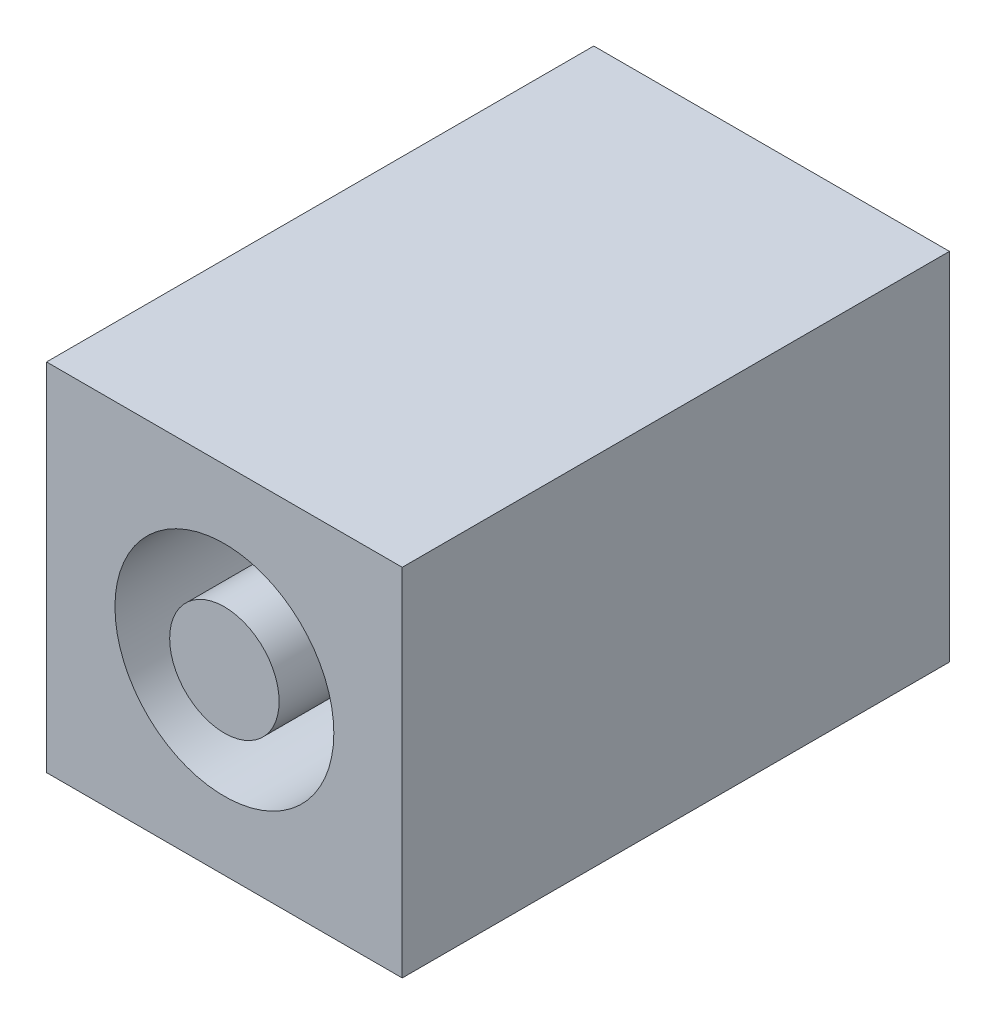
ISO-10303-21;
HEADER;
FILE_DESCRIPTION(('STEP AP214'),'2;1');
FILE_NAME('part.step','',(''),(''),'','','');
FILE_SCHEMA(('AUTOMOTIVE_DESIGN { 1 0 10303 214 1 1 1 1 }'));
ENDSEC;
DATA;
#1=APPLICATION_CONTEXT('core data for automotive mechanical design processes');
#2=APPLICATION_PROTOCOL_DEFINITION('international standard','automotive_design',2000,#1);
#3=PRODUCT_CONTEXT('',#1,'mechanical');
#4=PRODUCT('Part','Part','',(#3));
#5=PRODUCT_RELATED_PRODUCT_CATEGORY('part','',(#4));
#6=PRODUCT_DEFINITION_FORMATION('','',#4);
#7=PRODUCT_DEFINITION_CONTEXT('part definition',#1,'design');
#8=PRODUCT_DEFINITION('design','',#6,#7);
#9=PRODUCT_DEFINITION_SHAPE('','',#8);
#10=(LENGTH_UNIT() NAMED_UNIT(*) SI_UNIT(.MILLI.,.METRE.));
#11=(NAMED_UNIT(*) PLANE_ANGLE_UNIT() SI_UNIT($,.RADIAN.));
#12=(NAMED_UNIT(*) SI_UNIT($,.STERADIAN.) SOLID_ANGLE_UNIT());
#13=UNCERTAINTY_MEASURE_WITH_UNIT(LENGTH_MEASURE(1.E-05),#10,'distance_accuracy_value','');
#14=(GEOMETRIC_REPRESENTATION_CONTEXT(3) GLOBAL_UNCERTAINTY_ASSIGNED_CONTEXT((#13)) GLOBAL_UNIT_ASSIGNED_CONTEXT((#10,
#11,#12)) REPRESENTATION_CONTEXT('',''));
#15=CARTESIAN_POINT('',(0.,0.,0.));
#16=DIRECTION('',(0.,0.,1.));
#17=DIRECTION('',(1.,0.,0.));
#18=AXIS2_PLACEMENT_3D('',#15,#16,#17);
#19=CARTESIAN_POINT('',(0.,0.,200.));
#20=DIRECTION('',(0.,0.,-1.));
#21=DIRECTION('',(-1.,0.,0.));
#22=AXIS2_PLACEMENT_3D('',#19,#20,#21);
#23=CYLINDRICAL_SURFACE('',#22,40.);
#24=CARTESIAN_POINT('',(0.,0.,200.));
#25=DIRECTION('',(0.,0.,1.));
#26=DIRECTION('',(1.,0.,0.));
#27=AXIS2_PLACEMENT_3D('',#24,#25,#26);
#28=CIRCLE('',#27,40.);
#29=CARTESIAN_POINT('',(40.,0.,200.));
#30=VERTEX_POINT('',#29);
#31=EDGE_CURVE('E110',#30,#30,#28,.T.);
#32=ORIENTED_EDGE('',*,*,#31,.T.);
#33=EDGE_LOOP('',(#32));
#34=FACE_BOUND('',#33,.T.);
#35=CARTESIAN_POINT('',(0.,0.,3.));
#36=DIRECTION('',(0.,0.,-1.));
#37=DIRECTION('',(-1.,0.,0.));
#38=AXIS2_PLACEMENT_3D('',#35,#36,#37);
#39=CIRCLE('',#38,40.);
#40=CARTESIAN_POINT('',(-40.,0.,3.));
#41=VERTEX_POINT('',#40);
#42=EDGE_CURVE('E118',#41,#41,#39,.T.);
#43=ORIENTED_EDGE('',*,*,#42,.T.);
#44=EDGE_LOOP('',(#43));
#45=FACE_BOUND('',#44,.T.);
#46=ADVANCED_FACE('F47',(#34,#45),#23,.F.);
#47=CARTESIAN_POINT('',(65.,0.,200.));
#48=DIRECTION('',(1.,0.,0.));
#49=DIRECTION('',(0.,1.,0.));
#50=AXIS2_PLACEMENT_3D('',#47,#48,#49);
#51=PLANE('',#50);
#52=DIRECTION('',(0.,-1.,0.));
#53=VECTOR('',#52,1.);
#54=CARTESIAN_POINT('',(65.,0.,0.));
#55=LINE('',#54,#53);
#56=CARTESIAN_POINT('',(65.,65.,0.));
#57=VERTEX_POINT('',#56);
#58=CARTESIAN_POINT('',(65.,-65.,0.));
#59=VERTEX_POINT('',#58);
#60=EDGE_CURVE('E115',#57,#59,#55,.T.);
#61=ORIENTED_EDGE('',*,*,#60,.F.);
#62=DIRECTION('',(0.,0.,-1.));
#63=VECTOR('',#62,1.);
#64=CARTESIAN_POINT('',(65.,65.,200.));
#65=LINE('',#64,#63);
#66=CARTESIAN_POINT('',(65.,65.,200.));
#67=VERTEX_POINT('',#66);
#68=EDGE_CURVE('E55',#67,#57,#65,.T.);
#69=ORIENTED_EDGE('',*,*,#68,.F.);
#70=DIRECTION('',(0.,-1.,0.));
#71=VECTOR('',#70,1.);
#72=CARTESIAN_POINT('',(65.,0.,200.));
#73=LINE('',#72,#71);
#74=CARTESIAN_POINT('',(65.,-65.,200.));
#75=VERTEX_POINT('',#74);
#76=EDGE_CURVE('E108',#67,#75,#73,.T.);
#77=ORIENTED_EDGE('',*,*,#76,.T.);
#78=DIRECTION('',(0.,0.,-1.));
#79=VECTOR('',#78,1.);
#80=CARTESIAN_POINT('',(65.,-65.,200.));
#81=LINE('',#80,#79);
#82=EDGE_CURVE('E86',#75,#59,#81,.T.);
#83=ORIENTED_EDGE('',*,*,#82,.T.);
#84=EDGE_LOOP('',(#61,#69,#77,#83));
#85=FACE_BOUND('',#84,.T.);
#86=ADVANCED_FACE('F125',(#85),#51,.T.);
#87=CARTESIAN_POINT('',(0.,65.,200.));
#88=DIRECTION('',(0.,1.,0.));
#89=DIRECTION('',(0.,0.,1.));
#90=AXIS2_PLACEMENT_3D('',#87,#88,#89);
#91=PLANE('',#90);
#92=DIRECTION('',(1.,0.,0.));
#93=VECTOR('',#92,1.);
#94=CARTESIAN_POINT('',(0.,65.,0.));
#95=LINE('',#94,#93);
#96=CARTESIAN_POINT('',(-65.,65.,0.));
#97=VERTEX_POINT('',#96);
#98=EDGE_CURVE('E99',#97,#57,#95,.T.);
#99=ORIENTED_EDGE('',*,*,#98,.F.);
#100=DIRECTION('',(0.,0.,-1.));
#101=VECTOR('',#100,1.);
#102=CARTESIAN_POINT('',(-65.,65.,200.));
#103=LINE('',#102,#101);
#104=CARTESIAN_POINT('',(-65.,65.,200.));
#105=VERTEX_POINT('',#104);
#106=EDGE_CURVE('E93',#105,#97,#103,.T.);
#107=ORIENTED_EDGE('',*,*,#106,.F.);
#108=DIRECTION('',(1.,0.,0.));
#109=VECTOR('',#108,1.);
#110=CARTESIAN_POINT('',(0.,65.,200.));
#111=LINE('',#110,#109);
#112=EDGE_CURVE('E97',#105,#67,#111,.T.);
#113=ORIENTED_EDGE('',*,*,#112,.T.);
#114=ORIENTED_EDGE('',*,*,#68,.T.);
#115=EDGE_LOOP('',(#99,#107,#113,#114));
#116=FACE_BOUND('',#115,.T.);
#117=ADVANCED_FACE('F95',(#116),#91,.T.);
#118=CARTESIAN_POINT('',(-65.,0.,200.));
#119=DIRECTION('',(1.,0.,0.));
#120=DIRECTION('',(0.,0.,-1.));
#121=AXIS2_PLACEMENT_3D('',#118,#119,#120);
#122=PLANE('',#121);
#123=DIRECTION('',(0.,-1.,0.));
#124=VECTOR('',#123,1.);
#125=CARTESIAN_POINT('',(-65.,0.,0.));
#126=LINE('',#125,#124);
#127=CARTESIAN_POINT('',(-65.,-65.,0.));
#128=VERTEX_POINT('',#127);
#129=EDGE_CURVE('E120',#97,#128,#126,.T.);
#130=ORIENTED_EDGE('',*,*,#129,.T.);
#131=DIRECTION('',(0.,0.,-1.));
#132=VECTOR('',#131,1.);
#133=CARTESIAN_POINT('',(-65.,-65.,200.));
#134=LINE('',#133,#132);
#135=CARTESIAN_POINT('',(-65.,-65.,200.));
#136=VERTEX_POINT('',#135);
#137=EDGE_CURVE('E79',#136,#128,#134,.T.);
#138=ORIENTED_EDGE('',*,*,#137,.F.);
#139=DIRECTION('',(0.,-1.,0.));
#140=VECTOR('',#139,1.);
#141=CARTESIAN_POINT('',(-65.,0.,200.));
#142=LINE('',#141,#140);
#143=EDGE_CURVE('E104',#105,#136,#142,.T.);
#144=ORIENTED_EDGE('',*,*,#143,.F.);
#145=ORIENTED_EDGE('',*,*,#106,.T.);
#146=EDGE_LOOP('',(#130,#138,#144,#145));
#147=FACE_BOUND('',#146,.T.);
#148=ADVANCED_FACE('F105',(#147),#122,.F.);
#149=CARTESIAN_POINT('',(0.,-65.,200.));
#150=DIRECTION('',(0.,1.,0.));
#151=DIRECTION('',(0.,0.,1.));
#152=AXIS2_PLACEMENT_3D('',#149,#150,#151);
#153=PLANE('',#152);
#154=DIRECTION('',(1.,0.,0.));
#155=VECTOR('',#154,1.);
#156=CARTESIAN_POINT('',(0.,-65.,0.));
#157=LINE('',#156,#155);
#158=EDGE_CURVE('E122',#128,#59,#157,.T.);
#159=ORIENTED_EDGE('',*,*,#158,.T.);
#160=ORIENTED_EDGE('',*,*,#82,.F.);
#161=DIRECTION('',(1.,0.,0.));
#162=VECTOR('',#161,1.);
#163=CARTESIAN_POINT('',(0.,-65.,200.));
#164=LINE('',#163,#162);
#165=EDGE_CURVE('E63',#136,#75,#164,.T.);
#166=ORIENTED_EDGE('',*,*,#165,.F.);
#167=ORIENTED_EDGE('',*,*,#137,.T.);
#168=EDGE_LOOP('',(#159,#160,#166,#167));
#169=FACE_BOUND('',#168,.T.);
#170=ADVANCED_FACE('F128',(#169),#153,.F.);
#171=CARTESIAN_POINT('',(0.,0.,200.));
#172=DIRECTION('',(0.,0.,1.));
#173=DIRECTION('',(1.,0.,0.));
#174=AXIS2_PLACEMENT_3D('',#171,#172,#173);
#175=PLANE('',#174);
#176=ORIENTED_EDGE('',*,*,#31,.F.);
#177=EDGE_LOOP('',(#176));
#178=FACE_BOUND('',#177,.T.);
#179=ORIENTED_EDGE('',*,*,#76,.F.);
#180=ORIENTED_EDGE('',*,*,#112,.F.);
#181=ORIENTED_EDGE('',*,*,#143,.T.);
#182=ORIENTED_EDGE('',*,*,#165,.T.);
#183=EDGE_LOOP('',(#179,#180,#181,#182));
#184=FACE_BOUND('',#183,.T.);
#185=ADVANCED_FACE('F107',(#178,#184),#175,.T.);
#186=CARTESIAN_POINT('',(0.,0.,0.));
#187=DIRECTION('',(0.,0.,1.));
#188=DIRECTION('',(1.,0.,0.));
#189=AXIS2_PLACEMENT_3D('',#186,#187,#188);
#190=PLANE('',#189);
#191=ORIENTED_EDGE('',*,*,#60,.T.);
#192=ORIENTED_EDGE('',*,*,#158,.F.);
#193=ORIENTED_EDGE('',*,*,#129,.F.);
#194=ORIENTED_EDGE('',*,*,#98,.T.);
#195=EDGE_LOOP('',(#191,#192,#193,#194));
#196=FACE_BOUND('',#195,.T.);
#197=ADVANCED_FACE('F127',(#196),#190,.F.);
#198=CARTESIAN_POINT('',(0.,0.,3.));
#199=DIRECTION('',(0.,0.,-1.));
#200=DIRECTION('',(-1.,0.,0.));
#201=AXIS2_PLACEMENT_3D('',#198,#199,#200);
#202=PLANE('',#201);
#203=CARTESIAN_POINT('',(0.,0.,3.));
#204=DIRECTION('',(0.,0.,-1.));
#205=DIRECTION('',(-1.,0.,0.));
#206=AXIS2_PLACEMENT_3D('',#203,#204,#205);
#207=CIRCLE('',#206,20.);
#208=CARTESIAN_POINT('',(-20.,0.,3.));
#209=VERTEX_POINT('',#208);
#210=EDGE_CURVE('E12',#209,#209,#207,.F.);
#211=ORIENTED_EDGE('',*,*,#210,.F.);
#212=EDGE_LOOP('',(#211));
#213=FACE_BOUND('',#212,.T.);
#214=ORIENTED_EDGE('',*,*,#42,.F.);
#215=EDGE_LOOP('',(#214));
#216=FACE_BOUND('',#215,.T.);
#217=ADVANCED_FACE('F161',(#213,#216),#202,.F.);
#218=CARTESIAN_POINT('',(0.,0.,200.));
#219=DIRECTION('',(0.,0.,-1.));
#220=DIRECTION('',(-1.,0.,0.));
#221=AXIS2_PLACEMENT_3D('',#218,#219,#220);
#222=CYLINDRICAL_SURFACE('',#221,20.);
#223=CARTESIAN_POINT('',(0.,0.,200.));
#224=DIRECTION('',(0.,0.,1.));
#225=DIRECTION('',(1.,0.,0.));
#226=AXIS2_PLACEMENT_3D('',#223,#224,#225);
#227=CIRCLE('',#226,20.);
#228=CARTESIAN_POINT('',(20.,0.,200.));
#229=VERTEX_POINT('',#228);
#230=EDGE_CURVE('E150',#229,#229,#227,.T.);
#231=ORIENTED_EDGE('',*,*,#230,.F.);
#232=EDGE_LOOP('',(#231));
#233=FACE_BOUND('',#232,.T.);
#234=ORIENTED_EDGE('',*,*,#210,.T.);
#235=EDGE_LOOP('',(#234));
#236=FACE_BOUND('',#235,.T.);
#237=ADVANCED_FACE('F158',(#233,#236),#222,.T.);
#238=CARTESIAN_POINT('',(0.,0.,200.));
#239=DIRECTION('',(0.,0.,1.));
#240=DIRECTION('',(1.,0.,0.));
#241=AXIS2_PLACEMENT_3D('',#238,#239,#240);
#242=PLANE('',#241);
#243=ORIENTED_EDGE('',*,*,#230,.T.);
#244=EDGE_LOOP('',(#243));
#245=FACE_BOUND('',#244,.T.);
#246=ADVANCED_FACE('F156',(#245),#242,.T.);
#247=CLOSED_SHELL('',(#46,#86,#117,#148,#170,#185,#197,#217,#237,#246));
#248=MANIFOLD_SOLID_BREP('B2',#247);
#249=ADVANCED_BREP_SHAPE_REPRESENTATION('',(#18,#248),#14);
#250=SHAPE_DEFINITION_REPRESENTATION(#9,#249);
ENDSEC;
END-ISO-10303-21;
